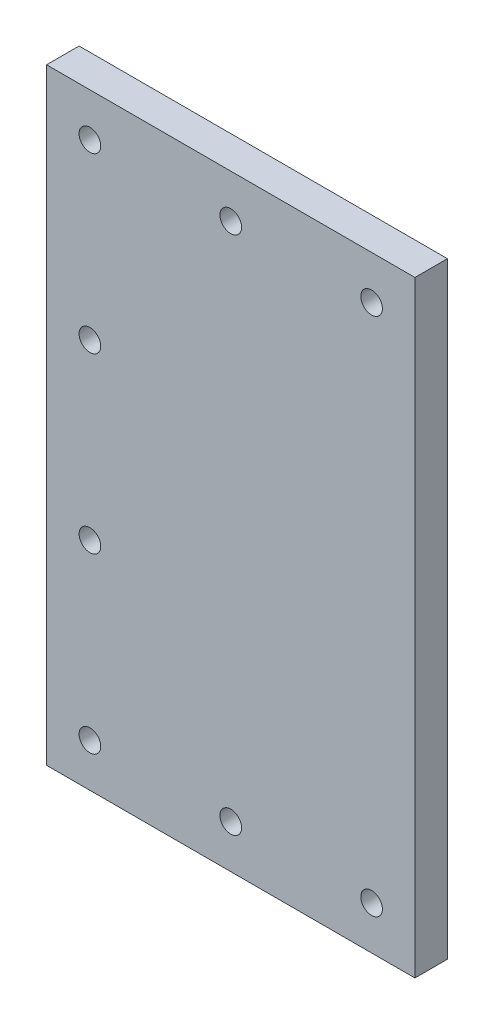
ISO-10303-21;
HEADER;
FILE_DESCRIPTION(('STEP AP214'),'2;1');
FILE_NAME('part.step','',(''),(''),'','','');
FILE_SCHEMA(('AUTOMOTIVE_DESIGN { 1 0 10303 214 1 1 1 1 }'));
ENDSEC;
DATA;
#1=APPLICATION_CONTEXT('core data for automotive mechanical design processes');
#2=APPLICATION_PROTOCOL_DEFINITION('international standard','automotive_design',2000,#1);
#3=PRODUCT_CONTEXT('',#1,'mechanical');
#4=PRODUCT('Part','Part','',(#3));
#5=PRODUCT_RELATED_PRODUCT_CATEGORY('part','',(#4));
#6=PRODUCT_DEFINITION_FORMATION('','',#4);
#7=PRODUCT_DEFINITION_CONTEXT('part definition',#1,'design');
#8=PRODUCT_DEFINITION('design','',#6,#7);
#9=PRODUCT_DEFINITION_SHAPE('','',#8);
#10=(LENGTH_UNIT() NAMED_UNIT(*) SI_UNIT(.MILLI.,.METRE.));
#11=(NAMED_UNIT(*) PLANE_ANGLE_UNIT() SI_UNIT($,.RADIAN.));
#12=(NAMED_UNIT(*) SI_UNIT($,.STERADIAN.) SOLID_ANGLE_UNIT());
#13=UNCERTAINTY_MEASURE_WITH_UNIT(LENGTH_MEASURE(1.E-05),#10,'distance_accuracy_value','');
#14=(GEOMETRIC_REPRESENTATION_CONTEXT(3) GLOBAL_UNCERTAINTY_ASSIGNED_CONTEXT((#13)) GLOBAL_UNIT_ASSIGNED_CONTEXT((#10,
#11,#12)) REPRESENTATION_CONTEXT('',''));
#15=CARTESIAN_POINT('',(0.,0.,0.));
#16=DIRECTION('',(0.,0.,1.));
#17=DIRECTION('',(1.,0.,0.));
#18=AXIS2_PLACEMENT_3D('',#15,#16,#17);
#19=CARTESIAN_POINT('',(32.5,-60.,-3.75));
#20=DIRECTION('',(0.,0.,1.));
#21=DIRECTION('',(1.,0.,0.));
#22=AXIS2_PLACEMENT_3D('',#19,#20,#21);
#23=CYLINDRICAL_SURFACE('',#22,2.5);
#24=CARTESIAN_POINT('',(32.5,-60.,3.75));
#25=DIRECTION('',(0.,0.,1.));
#26=DIRECTION('',(1.,0.,0.));
#27=AXIS2_PLACEMENT_3D('',#24,#25,#26);
#28=CIRCLE('',#27,2.5);
#29=CARTESIAN_POINT('',(35.,-60.,3.75));
#30=VERTEX_POINT('',#29);
#31=EDGE_CURVE('E42',#30,#30,#28,.T.);
#32=ORIENTED_EDGE('',*,*,#31,.T.);
#33=EDGE_LOOP('',(#32));
#34=FACE_BOUND('',#33,.T.);
#35=CARTESIAN_POINT('',(32.5,-60.,-3.75));
#36=DIRECTION('',(0.,0.,1.));
#37=DIRECTION('',(1.,0.,0.));
#38=AXIS2_PLACEMENT_3D('',#35,#36,#37);
#39=CIRCLE('',#38,2.5);
#40=CARTESIAN_POINT('',(35.,-60.,-3.75));
#41=VERTEX_POINT('',#40);
#42=EDGE_CURVE('E11',#41,#41,#39,.T.);
#43=ORIENTED_EDGE('',*,*,#42,.F.);
#44=EDGE_LOOP('',(#43));
#45=FACE_BOUND('',#44,.T.);
#46=ADVANCED_FACE('F34',(#34,#45),#23,.F.);
#47=CARTESIAN_POINT('',(0.,-60.,-3.75));
#48=DIRECTION('',(0.,0.,1.));
#49=DIRECTION('',(1.,0.,0.));
#50=AXIS2_PLACEMENT_3D('',#47,#48,#49);
#51=CYLINDRICAL_SURFACE('',#50,2.5);
#52=CARTESIAN_POINT('',(0.,-60.,3.75));
#53=DIRECTION('',(0.,0.,1.));
#54=DIRECTION('',(1.,0.,0.));
#55=AXIS2_PLACEMENT_3D('',#52,#53,#54);
#56=CIRCLE('',#55,2.5);
#57=CARTESIAN_POINT('',(2.50000000000001,-60.,3.75));
#58=VERTEX_POINT('',#57);
#59=EDGE_CURVE('E136',#58,#58,#56,.T.);
#60=ORIENTED_EDGE('',*,*,#59,.T.);
#61=EDGE_LOOP('',(#60));
#62=FACE_BOUND('',#61,.T.);
#63=CARTESIAN_POINT('',(0.,-60.,-3.75));
#64=DIRECTION('',(0.,0.,1.));
#65=DIRECTION('',(1.,0.,0.));
#66=AXIS2_PLACEMENT_3D('',#63,#64,#65);
#67=CIRCLE('',#66,2.5);
#68=CARTESIAN_POINT('',(2.50000000000001,-60.,-3.75));
#69=VERTEX_POINT('',#68);
#70=EDGE_CURVE('E139',#69,#69,#67,.T.);
#71=ORIENTED_EDGE('',*,*,#70,.F.);
#72=EDGE_LOOP('',(#71));
#73=FACE_BOUND('',#72,.T.);
#74=ADVANCED_FACE('F163',(#62,#73),#51,.F.);
#75=CARTESIAN_POINT('',(-32.5,-60.,-3.75));
#76=DIRECTION('',(0.,0.,1.));
#77=DIRECTION('',(1.,0.,0.));
#78=AXIS2_PLACEMENT_3D('',#75,#76,#77);
#79=CYLINDRICAL_SURFACE('',#78,2.5);
#80=CARTESIAN_POINT('',(-32.5,-60.,3.75));
#81=DIRECTION('',(0.,0.,1.));
#82=DIRECTION('',(1.,0.,0.));
#83=AXIS2_PLACEMENT_3D('',#80,#81,#82);
#84=CIRCLE('',#83,2.5);
#85=CARTESIAN_POINT('',(-30.,-60.,3.75));
#86=VERTEX_POINT('',#85);
#87=EDGE_CURVE('E130',#86,#86,#84,.T.);
#88=ORIENTED_EDGE('',*,*,#87,.T.);
#89=EDGE_LOOP('',(#88));
#90=FACE_BOUND('',#89,.T.);
#91=CARTESIAN_POINT('',(-32.5,-60.,-3.75));
#92=DIRECTION('',(0.,0.,1.));
#93=DIRECTION('',(1.,0.,0.));
#94=AXIS2_PLACEMENT_3D('',#91,#92,#93);
#95=CIRCLE('',#94,2.5);
#96=CARTESIAN_POINT('',(-30.,-60.,-3.75));
#97=VERTEX_POINT('',#96);
#98=EDGE_CURVE('E133',#97,#97,#95,.T.);
#99=ORIENTED_EDGE('',*,*,#98,.F.);
#100=EDGE_LOOP('',(#99));
#101=FACE_BOUND('',#100,.T.);
#102=ADVANCED_FACE('F167',(#90,#101),#79,.F.);
#103=CARTESIAN_POINT('',(-32.5,-20.,-3.75));
#104=DIRECTION('',(0.,0.,1.));
#105=DIRECTION('',(1.,0.,0.));
#106=AXIS2_PLACEMENT_3D('',#103,#104,#105);
#107=CYLINDRICAL_SURFACE('',#106,2.5);
#108=CARTESIAN_POINT('',(-32.5,-20.,3.75));
#109=DIRECTION('',(0.,0.,1.));
#110=DIRECTION('',(1.,0.,0.));
#111=AXIS2_PLACEMENT_3D('',#108,#109,#110);
#112=CIRCLE('',#111,2.5);
#113=CARTESIAN_POINT('',(-30.,-20.,3.75));
#114=VERTEX_POINT('',#113);
#115=EDGE_CURVE('E124',#114,#114,#112,.T.);
#116=ORIENTED_EDGE('',*,*,#115,.T.);
#117=EDGE_LOOP('',(#116));
#118=FACE_BOUND('',#117,.T.);
#119=CARTESIAN_POINT('',(-32.5,-20.,-3.75));
#120=DIRECTION('',(0.,0.,1.));
#121=DIRECTION('',(1.,0.,0.));
#122=AXIS2_PLACEMENT_3D('',#119,#120,#121);
#123=CIRCLE('',#122,2.5);
#124=CARTESIAN_POINT('',(-30.,-20.,-3.75));
#125=VERTEX_POINT('',#124);
#126=EDGE_CURVE('E127',#125,#125,#123,.T.);
#127=ORIENTED_EDGE('',*,*,#126,.F.);
#128=EDGE_LOOP('',(#127));
#129=FACE_BOUND('',#128,.T.);
#130=ADVANCED_FACE('F172',(#118,#129),#107,.F.);
#131=CARTESIAN_POINT('',(-32.5,20.,-3.75));
#132=DIRECTION('',(0.,0.,1.));
#133=DIRECTION('',(1.,0.,0.));
#134=AXIS2_PLACEMENT_3D('',#131,#132,#133);
#135=CYLINDRICAL_SURFACE('',#134,2.5);
#136=CARTESIAN_POINT('',(-32.5,20.,3.75));
#137=DIRECTION('',(0.,0.,1.));
#138=DIRECTION('',(1.,0.,0.));
#139=AXIS2_PLACEMENT_3D('',#136,#137,#138);
#140=CIRCLE('',#139,2.5);
#141=CARTESIAN_POINT('',(-30.,20.,3.75));
#142=VERTEX_POINT('',#141);
#143=EDGE_CURVE('E118',#142,#142,#140,.T.);
#144=ORIENTED_EDGE('',*,*,#143,.T.);
#145=EDGE_LOOP('',(#144));
#146=FACE_BOUND('',#145,.T.);
#147=CARTESIAN_POINT('',(-32.5,20.,-3.75));
#148=DIRECTION('',(0.,0.,1.));
#149=DIRECTION('',(1.,0.,0.));
#150=AXIS2_PLACEMENT_3D('',#147,#148,#149);
#151=CIRCLE('',#150,2.5);
#152=CARTESIAN_POINT('',(-30.,20.,-3.75));
#153=VERTEX_POINT('',#152);
#154=EDGE_CURVE('E121',#153,#153,#151,.T.);
#155=ORIENTED_EDGE('',*,*,#154,.F.);
#156=EDGE_LOOP('',(#155));
#157=FACE_BOUND('',#156,.T.);
#158=ADVANCED_FACE('F179',(#146,#157),#135,.F.);
#159=CARTESIAN_POINT('',(32.5,60.,-3.75));
#160=DIRECTION('',(0.,0.,1.));
#161=DIRECTION('',(1.,0.,0.));
#162=AXIS2_PLACEMENT_3D('',#159,#160,#161);
#163=CYLINDRICAL_SURFACE('',#162,2.5);
#164=CARTESIAN_POINT('',(32.5,60.,3.75));
#165=DIRECTION('',(0.,0.,1.));
#166=DIRECTION('',(1.,0.,0.));
#167=AXIS2_PLACEMENT_3D('',#164,#165,#166);
#168=CIRCLE('',#167,2.5);
#169=CARTESIAN_POINT('',(35.,60.,3.75));
#170=VERTEX_POINT('',#169);
#171=EDGE_CURVE('E112',#170,#170,#168,.T.);
#172=ORIENTED_EDGE('',*,*,#171,.T.);
#173=EDGE_LOOP('',(#172));
#174=FACE_BOUND('',#173,.T.);
#175=CARTESIAN_POINT('',(32.5,60.,-3.75));
#176=DIRECTION('',(0.,0.,1.));
#177=DIRECTION('',(1.,0.,0.));
#178=AXIS2_PLACEMENT_3D('',#175,#176,#177);
#179=CIRCLE('',#178,2.5);
#180=CARTESIAN_POINT('',(35.,60.,-3.75));
#181=VERTEX_POINT('',#180);
#182=EDGE_CURVE('E115',#181,#181,#179,.T.);
#183=ORIENTED_EDGE('',*,*,#182,.F.);
#184=EDGE_LOOP('',(#183));
#185=FACE_BOUND('',#184,.T.);
#186=ADVANCED_FACE('F183',(#174,#185),#163,.F.);
#187=CARTESIAN_POINT('',(-42.5,-70.,3.75));
#188=DIRECTION('',(1.,0.,0.));
#189=DIRECTION('',(0.,1.,0.));
#190=AXIS2_PLACEMENT_3D('',#187,#188,#189);
#191=PLANE('',#190);
#192=DIRECTION('',(0.,-1.,0.));
#193=VECTOR('',#192,1.);
#194=CARTESIAN_POINT('',(-42.5,-70.,-3.75));
#195=LINE('',#194,#193);
#196=CARTESIAN_POINT('',(-42.5,70.,-3.75));
#197=VERTEX_POINT('',#196);
#198=CARTESIAN_POINT('',(-42.5,-70.,-3.75));
#199=VERTEX_POINT('',#198);
#200=EDGE_CURVE('E102',#197,#199,#195,.T.);
#201=ORIENTED_EDGE('',*,*,#200,.T.);
#202=DIRECTION('',(0.,0.,-1.));
#203=VECTOR('',#202,1.);
#204=CARTESIAN_POINT('',(-42.5,-70.,3.75));
#205=LINE('',#204,#203);
#206=CARTESIAN_POINT('',(-42.5,-70.,3.75));
#207=VERTEX_POINT('',#206);
#208=EDGE_CURVE('E93',#207,#199,#205,.T.);
#209=ORIENTED_EDGE('',*,*,#208,.F.);
#210=DIRECTION('',(0.,-1.,0.));
#211=VECTOR('',#210,1.);
#212=CARTESIAN_POINT('',(-42.5,-70.,3.75));
#213=LINE('',#212,#211);
#214=CARTESIAN_POINT('',(-42.5,70.,3.75));
#215=VERTEX_POINT('',#214);
#216=EDGE_CURVE('E87',#215,#207,#213,.T.);
#217=ORIENTED_EDGE('',*,*,#216,.F.);
#218=DIRECTION('',(0.,0.,-1.));
#219=VECTOR('',#218,1.);
#220=CARTESIAN_POINT('',(-42.5,70.,3.75));
#221=LINE('',#220,#219);
#222=EDGE_CURVE('E98',#215,#197,#221,.T.);
#223=ORIENTED_EDGE('',*,*,#222,.T.);
#224=EDGE_LOOP('',(#201,#209,#217,#223));
#225=FACE_BOUND('',#224,.T.);
#226=ADVANCED_FACE('F187',(#225),#191,.F.);
#227=CARTESIAN_POINT('',(42.5,-70.,3.75));
#228=DIRECTION('',(0.,1.,0.));
#229=DIRECTION('',(-1.,0.,0.));
#230=AXIS2_PLACEMENT_3D('',#227,#228,#229);
#231=PLANE('',#230);
#232=DIRECTION('',(1.,0.,0.));
#233=VECTOR('',#232,1.);
#234=CARTESIAN_POINT('',(42.5,-70.,-3.75));
#235=LINE('',#234,#233);
#236=CARTESIAN_POINT('',(42.5,-70.,-3.75));
#237=VERTEX_POINT('',#236);
#238=EDGE_CURVE('E92',#199,#237,#235,.T.);
#239=ORIENTED_EDGE('',*,*,#238,.T.);
#240=DIRECTION('',(0.,0.,-1.));
#241=VECTOR('',#240,1.);
#242=CARTESIAN_POINT('',(42.5,-70.,3.75));
#243=LINE('',#242,#241);
#244=CARTESIAN_POINT('',(42.5,-70.,3.75));
#245=VERTEX_POINT('',#244);
#246=EDGE_CURVE('E90',#245,#237,#243,.T.);
#247=ORIENTED_EDGE('',*,*,#246,.F.);
#248=DIRECTION('',(1.,0.,0.));
#249=VECTOR('',#248,1.);
#250=CARTESIAN_POINT('',(42.5,-70.,3.75));
#251=LINE('',#250,#249);
#252=EDGE_CURVE('E81',#207,#245,#251,.T.);
#253=ORIENTED_EDGE('',*,*,#252,.F.);
#254=ORIENTED_EDGE('',*,*,#208,.T.);
#255=EDGE_LOOP('',(#239,#247,#253,#254));
#256=FACE_BOUND('',#255,.T.);
#257=ADVANCED_FACE('F91',(#256),#231,.F.);
#258=CARTESIAN_POINT('',(42.5,-70.,3.75));
#259=DIRECTION('',(-1.,0.,0.));
#260=DIRECTION('',(0.,0.,1.));
#261=AXIS2_PLACEMENT_3D('',#258,#259,#260);
#262=PLANE('',#261);
#263=DIRECTION('',(0.,1.,0.));
#264=VECTOR('',#263,1.);
#265=CARTESIAN_POINT('',(42.5,-70.,-3.75));
#266=LINE('',#265,#264);
#267=CARTESIAN_POINT('',(42.5,70.,-3.75));
#268=VERTEX_POINT('',#267);
#269=EDGE_CURVE('E67',#237,#268,#266,.T.);
#270=ORIENTED_EDGE('',*,*,#269,.T.);
#271=DIRECTION('',(0.,0.,-1.));
#272=VECTOR('',#271,1.);
#273=CARTESIAN_POINT('',(42.5,70.,3.75));
#274=LINE('',#273,#272);
#275=CARTESIAN_POINT('',(42.5,70.,3.75));
#276=VERTEX_POINT('',#275);
#277=EDGE_CURVE('E94',#276,#268,#274,.T.);
#278=ORIENTED_EDGE('',*,*,#277,.F.);
#279=DIRECTION('',(0.,1.,0.));
#280=VECTOR('',#279,1.);
#281=CARTESIAN_POINT('',(42.5,-70.,3.75));
#282=LINE('',#281,#280);
#283=EDGE_CURVE('E85',#245,#276,#282,.T.);
#284=ORIENTED_EDGE('',*,*,#283,.F.);
#285=ORIENTED_EDGE('',*,*,#246,.T.);
#286=EDGE_LOOP('',(#270,#278,#284,#285));
#287=FACE_BOUND('',#286,.T.);
#288=ADVANCED_FACE('F96',(#287),#262,.F.);
#289=CARTESIAN_POINT('',(42.5,70.,3.75));
#290=DIRECTION('',(0.,-1.,0.));
#291=DIRECTION('',(1.,0.,0.));
#292=AXIS2_PLACEMENT_3D('',#289,#290,#291);
#293=PLANE('',#292);
#294=DIRECTION('',(-1.,0.,0.));
#295=VECTOR('',#294,1.);
#296=CARTESIAN_POINT('',(42.5,70.,-3.75));
#297=LINE('',#296,#295);
#298=EDGE_CURVE('E73',#268,#197,#297,.T.);
#299=ORIENTED_EDGE('',*,*,#298,.T.);
#300=ORIENTED_EDGE('',*,*,#222,.F.);
#301=DIRECTION('',(-1.,0.,0.));
#302=VECTOR('',#301,1.);
#303=CARTESIAN_POINT('',(42.5,70.,3.75));
#304=LINE('',#303,#302);
#305=EDGE_CURVE('E50',#276,#215,#304,.T.);
#306=ORIENTED_EDGE('',*,*,#305,.F.);
#307=ORIENTED_EDGE('',*,*,#277,.T.);
#308=EDGE_LOOP('',(#299,#300,#306,#307));
#309=FACE_BOUND('',#308,.T.);
#310=ADVANCED_FACE('F148',(#309),#293,.F.);
#311=CARTESIAN_POINT('',(0.,0.,3.75));
#312=DIRECTION('',(0.,0.,1.));
#313=DIRECTION('',(1.,0.,0.));
#314=AXIS2_PLACEMENT_3D('',#311,#312,#313);
#315=PLANE('',#314);
#316=CARTESIAN_POINT('',(0.,60.,3.75));
#317=DIRECTION('',(0.,0.,1.));
#318=DIRECTION('',(1.,0.,0.));
#319=AXIS2_PLACEMENT_3D('',#316,#317,#318);
#320=CIRCLE('',#319,2.5);
#321=CARTESIAN_POINT('',(2.5,60.,3.75));
#322=VERTEX_POINT('',#321);
#323=EDGE_CURVE('E269',#322,#322,#320,.T.);
#324=ORIENTED_EDGE('',*,*,#323,.F.);
#325=EDGE_LOOP('',(#324));
#326=FACE_BOUND('',#325,.T.);
#327=CARTESIAN_POINT('',(-32.5,60.,3.75));
#328=DIRECTION('',(0.,0.,1.));
#329=DIRECTION('',(1.,0.,0.));
#330=AXIS2_PLACEMENT_3D('',#327,#328,#329);
#331=CIRCLE('',#330,2.5);
#332=CARTESIAN_POINT('',(-30.,60.,3.75));
#333=VERTEX_POINT('',#332);
#334=EDGE_CURVE('E105',#333,#333,#331,.T.);
#335=ORIENTED_EDGE('',*,*,#334,.F.);
#336=EDGE_LOOP('',(#335));
#337=FACE_BOUND('',#336,.T.);
#338=ORIENTED_EDGE('',*,*,#216,.T.);
#339=ORIENTED_EDGE('',*,*,#252,.T.);
#340=ORIENTED_EDGE('',*,*,#283,.T.);
#341=ORIENTED_EDGE('',*,*,#305,.T.);
#342=EDGE_LOOP('',(#338,#339,#340,#341));
#343=FACE_BOUND('',#342,.T.);
#344=ORIENTED_EDGE('',*,*,#171,.F.);
#345=EDGE_LOOP('',(#344));
#346=FACE_BOUND('',#345,.T.);
#347=ORIENTED_EDGE('',*,*,#143,.F.);
#348=EDGE_LOOP('',(#347));
#349=FACE_BOUND('',#348,.T.);
#350=ORIENTED_EDGE('',*,*,#115,.F.);
#351=EDGE_LOOP('',(#350));
#352=FACE_BOUND('',#351,.T.);
#353=ORIENTED_EDGE('',*,*,#87,.F.);
#354=EDGE_LOOP('',(#353));
#355=FACE_BOUND('',#354,.T.);
#356=ORIENTED_EDGE('',*,*,#59,.F.);
#357=EDGE_LOOP('',(#356));
#358=FACE_BOUND('',#357,.T.);
#359=ORIENTED_EDGE('',*,*,#31,.F.);
#360=EDGE_LOOP('',(#359));
#361=FACE_BOUND('',#360,.T.);
#362=ADVANCED_FACE('F82',(#326,#337,#343,#346,#349,#352,#355,#358,#361),#315,.T.);
#363=CARTESIAN_POINT('',(0.,0.,-3.75));
#364=DIRECTION('',(0.,0.,1.));
#365=DIRECTION('',(1.,0.,0.));
#366=AXIS2_PLACEMENT_3D('',#363,#364,#365);
#367=PLANE('',#366);
#368=CARTESIAN_POINT('',(0.,60.,-3.75));
#369=DIRECTION('',(0.,0.,1.));
#370=DIRECTION('',(1.,0.,0.));
#371=AXIS2_PLACEMENT_3D('',#368,#369,#370);
#372=CIRCLE('',#371,2.5);
#373=CARTESIAN_POINT('',(2.5,60.,-3.75));
#374=VERTEX_POINT('',#373);
#375=EDGE_CURVE('E272',#374,#374,#372,.T.);
#376=ORIENTED_EDGE('',*,*,#375,.T.);
#377=EDGE_LOOP('',(#376));
#378=FACE_BOUND('',#377,.T.);
#379=CARTESIAN_POINT('',(-32.5,60.,-3.75));
#380=DIRECTION('',(0.,0.,1.));
#381=DIRECTION('',(1.,0.,0.));
#382=AXIS2_PLACEMENT_3D('',#379,#380,#381);
#383=CIRCLE('',#382,2.5);
#384=CARTESIAN_POINT('',(-30.,60.,-3.75));
#385=VERTEX_POINT('',#384);
#386=EDGE_CURVE('E273',#385,#385,#383,.T.);
#387=ORIENTED_EDGE('',*,*,#386,.T.);
#388=EDGE_LOOP('',(#387));
#389=FACE_BOUND('',#388,.T.);
#390=ORIENTED_EDGE('',*,*,#200,.F.);
#391=ORIENTED_EDGE('',*,*,#298,.F.);
#392=ORIENTED_EDGE('',*,*,#269,.F.);
#393=ORIENTED_EDGE('',*,*,#238,.F.);
#394=EDGE_LOOP('',(#390,#391,#392,#393));
#395=FACE_BOUND('',#394,.T.);
#396=ORIENTED_EDGE('',*,*,#182,.T.);
#397=EDGE_LOOP('',(#396));
#398=FACE_BOUND('',#397,.T.);
#399=ORIENTED_EDGE('',*,*,#154,.T.);
#400=EDGE_LOOP('',(#399));
#401=FACE_BOUND('',#400,.T.);
#402=ORIENTED_EDGE('',*,*,#126,.T.);
#403=EDGE_LOOP('',(#402));
#404=FACE_BOUND('',#403,.T.);
#405=ORIENTED_EDGE('',*,*,#98,.T.);
#406=EDGE_LOOP('',(#405));
#407=FACE_BOUND('',#406,.T.);
#408=ORIENTED_EDGE('',*,*,#70,.T.);
#409=EDGE_LOOP('',(#408));
#410=FACE_BOUND('',#409,.T.);
#411=ORIENTED_EDGE('',*,*,#42,.T.);
#412=EDGE_LOOP('',(#411));
#413=FACE_BOUND('',#412,.T.);
#414=ADVANCED_FACE('F147',(#378,#389,#395,#398,#401,#404,#407,#410,#413),#367,.F.);
#415=CARTESIAN_POINT('',(-32.5,60.,-3.75));
#416=DIRECTION('',(0.,0.,1.));
#417=DIRECTION('',(1.,0.,0.));
#418=AXIS2_PLACEMENT_3D('',#415,#416,#417);
#419=CYLINDRICAL_SURFACE('',#418,2.5);
#420=ORIENTED_EDGE('',*,*,#334,.T.);
#421=EDGE_LOOP('',(#420));
#422=FACE_BOUND('',#421,.T.);
#423=ORIENTED_EDGE('',*,*,#386,.F.);
#424=EDGE_LOOP('',(#423));
#425=FACE_BOUND('',#424,.T.);
#426=ADVANCED_FACE('F155',(#422,#425),#419,.F.);
#427=CARTESIAN_POINT('',(0.,60.,-3.75));
#428=DIRECTION('',(0.,0.,1.));
#429=DIRECTION('',(1.,0.,0.));
#430=AXIS2_PLACEMENT_3D('',#427,#428,#429);
#431=CYLINDRICAL_SURFACE('',#430,2.5);
#432=ORIENTED_EDGE('',*,*,#323,.T.);
#433=EDGE_LOOP('',(#432));
#434=FACE_BOUND('',#433,.T.);
#435=ORIENTED_EDGE('',*,*,#375,.F.);
#436=EDGE_LOOP('',(#435));
#437=FACE_BOUND('',#436,.T.);
#438=ADVANCED_FACE('F212',(#434,#437),#431,.F.);
#439=CLOSED_SHELL('',(#46,#74,#102,#130,#158,#186,#226,#257,#288,#310,#362,#414,#426,#438));
#440=MANIFOLD_SOLID_BREP('B2',#439);
#441=ADVANCED_BREP_SHAPE_REPRESENTATION('',(#18,#440),#14);
#442=SHAPE_DEFINITION_REPRESENTATION(#9,#441);
ENDSEC;
END-ISO-10303-21;
